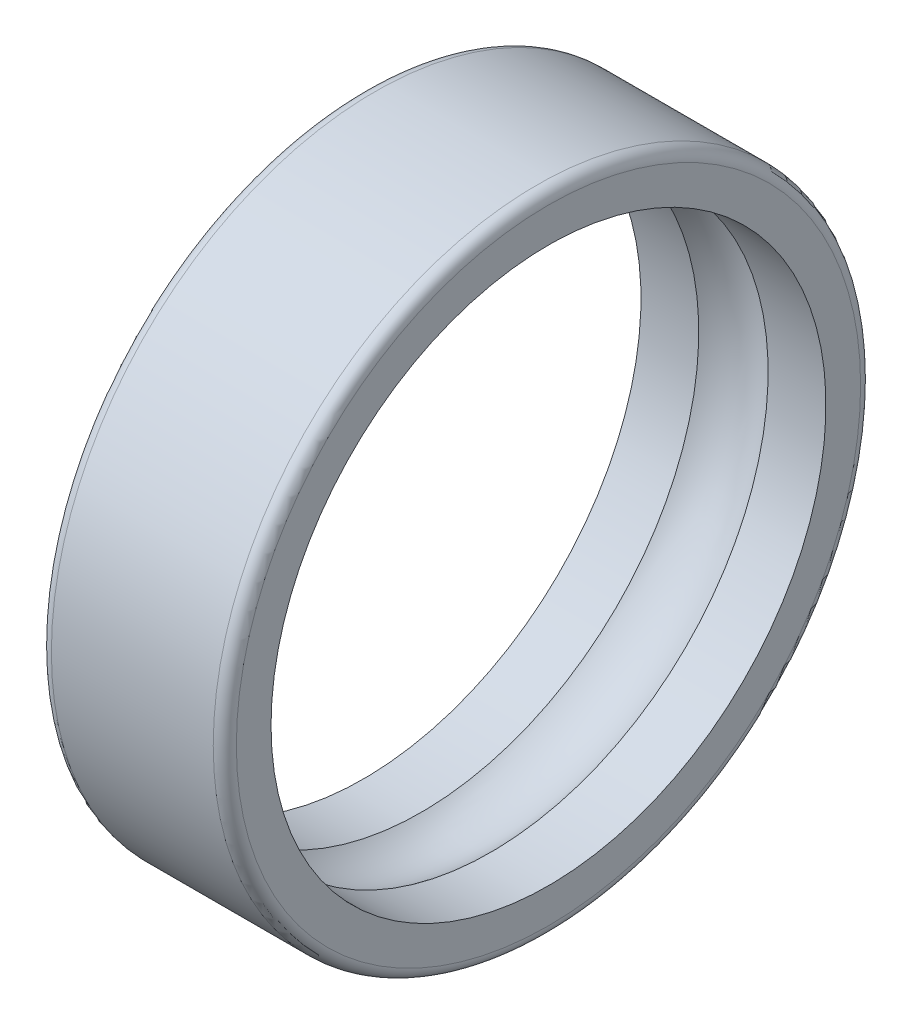
ISO-10303-21;
HEADER;
FILE_DESCRIPTION(('STEP AP214'),'2;1');
FILE_NAME('part.step','',(''),(''),'','','');
FILE_SCHEMA(('AUTOMOTIVE_DESIGN { 1 0 10303 214 1 1 1 1 }'));
ENDSEC;
DATA;
#1=APPLICATION_CONTEXT('core data for automotive mechanical design processes');
#2=APPLICATION_PROTOCOL_DEFINITION('international standard','automotive_design',2000,#1);
#3=PRODUCT_CONTEXT('',#1,'mechanical');
#4=PRODUCT('Part','Part','',(#3));
#5=PRODUCT_RELATED_PRODUCT_CATEGORY('part','',(#4));
#6=PRODUCT_DEFINITION_FORMATION('','',#4);
#7=PRODUCT_DEFINITION_CONTEXT('part definition',#1,'design');
#8=PRODUCT_DEFINITION('design','',#6,#7);
#9=PRODUCT_DEFINITION_SHAPE('','',#8);
#10=(LENGTH_UNIT() NAMED_UNIT(*) SI_UNIT(.MILLI.,.METRE.));
#11=(NAMED_UNIT(*) PLANE_ANGLE_UNIT() SI_UNIT($,.RADIAN.));
#12=(NAMED_UNIT(*) SI_UNIT($,.STERADIAN.) SOLID_ANGLE_UNIT());
#13=UNCERTAINTY_MEASURE_WITH_UNIT(LENGTH_MEASURE(1.E-05),#10,'distance_accuracy_value','');
#14=(GEOMETRIC_REPRESENTATION_CONTEXT(3) GLOBAL_UNCERTAINTY_ASSIGNED_CONTEXT((#13)) GLOBAL_UNIT_ASSIGNED_CONTEXT((#10,
#11,#12)) REPRESENTATION_CONTEXT('',''));
#15=CARTESIAN_POINT('',(0.,0.,0.));
#16=DIRECTION('',(0.,0.,1.));
#17=DIRECTION('',(1.,0.,0.));
#18=AXIS2_PLACEMENT_3D('',#15,#16,#17);
#19=CARTESIAN_POINT('',(0.5,0.,0.));
#20=DIRECTION('',(-1.,0.,0.));
#21=DIRECTION('',(0.,0.,1.));
#22=AXIS2_PLACEMENT_3D('',#19,#20,#21);
#23=TOROIDAL_SURFACE('',#22,13.5,0.5);
#24=CARTESIAN_POINT('',(0.,0.,0.));
#25=DIRECTION('',(-1.,0.,0.));
#26=DIRECTION('',(0.,0.,1.));
#27=AXIS2_PLACEMENT_3D('',#24,#25,#26);
#28=CIRCLE('',#27,13.5);
#29=CARTESIAN_POINT('',(0.,0.,13.5));
#30=VERTEX_POINT('',#29);
#31=EDGE_CURVE('E10',#30,#30,#28,.T.);
#32=ORIENTED_EDGE('',*,*,#31,.F.);
#33=EDGE_LOOP('',(#32));
#34=FACE_BOUND('',#33,.T.);
#35=CARTESIAN_POINT('',(0.500000000000003,0.,0.));
#36=DIRECTION('',(-1.,0.,0.));
#37=DIRECTION('',(0.,0.,1.));
#38=AXIS2_PLACEMENT_3D('',#35,#36,#37);
#39=CIRCLE('',#38,14.);
#40=CARTESIAN_POINT('',(0.500000000000003,0.,14.));
#41=VERTEX_POINT('',#40);
#42=EDGE_CURVE('E55',#41,#41,#39,.T.);
#43=ORIENTED_EDGE('',*,*,#42,.T.);
#44=EDGE_LOOP('',(#43));
#45=FACE_BOUND('',#44,.T.);
#46=ADVANCED_FACE('F27',(#34,#45),#23,.T.);
#47=CARTESIAN_POINT('',(0.,12.,0.));
#48=DIRECTION('',(-1.,0.,0.));
#49=DIRECTION('',(0.,0.,1.));
#50=AXIS2_PLACEMENT_3D('',#47,#48,#49);
#51=PLANE('',#50);
#52=ORIENTED_EDGE('',*,*,#31,.T.);
#53=EDGE_LOOP('',(#52));
#54=FACE_BOUND('',#53,.T.);
#55=CARTESIAN_POINT('',(0.,0.,0.));
#56=DIRECTION('',(-1.,0.,0.));
#57=DIRECTION('',(0.,0.,1.));
#58=AXIS2_PLACEMENT_3D('',#55,#56,#57);
#59=CIRCLE('',#58,12.);
#60=CARTESIAN_POINT('',(0.,0.,12.));
#61=VERTEX_POINT('',#60);
#62=EDGE_CURVE('E33',#61,#61,#59,.T.);
#63=ORIENTED_EDGE('',*,*,#62,.F.);
#64=EDGE_LOOP('',(#63));
#65=FACE_BOUND('',#64,.T.);
#66=ADVANCED_FACE('F84',(#54,#65),#51,.T.);
#67=CARTESIAN_POINT('',(0.,0.,0.));
#68=DIRECTION('',(-1.,0.,0.));
#69=DIRECTION('',(0.,0.,1.));
#70=AXIS2_PLACEMENT_3D('',#67,#68,#69);
#71=CYLINDRICAL_SURFACE('',#70,12.);
#72=CARTESIAN_POINT('',(2.5,0.,0.));
#73=DIRECTION('',(-1.,0.,0.));
#74=DIRECTION('',(0.,0.,1.));
#75=AXIS2_PLACEMENT_3D('',#72,#73,#74);
#76=CIRCLE('',#75,12.);
#77=CARTESIAN_POINT('',(2.5,0.,12.));
#78=VERTEX_POINT('',#77);
#79=EDGE_CURVE('E37',#78,#78,#76,.T.);
#80=ORIENTED_EDGE('',*,*,#79,.F.);
#81=EDGE_LOOP('',(#80));
#82=FACE_BOUND('',#81,.T.);
#83=ORIENTED_EDGE('',*,*,#62,.T.);
#84=EDGE_LOOP('',(#83));
#85=FACE_BOUND('',#84,.T.);
#86=ADVANCED_FACE('F89',(#82,#85),#71,.F.);
#87=CARTESIAN_POINT('',(4.,0.,0.));
#88=DIRECTION('',(-1.,0.,0.));
#89=DIRECTION('',(0.,0.,1.));
#90=AXIS2_PLACEMENT_3D('',#87,#88,#89);
#91=TOROIDAL_SURFACE('',#90,10.,2.5);
#92=ORIENTED_EDGE('',*,*,#79,.T.);
#93=EDGE_LOOP('',(#92));
#94=FACE_BOUND('',#93,.T.);
#95=CARTESIAN_POINT('',(5.5,0.,0.));
#96=DIRECTION('',(-1.,0.,0.));
#97=DIRECTION('',(0.,0.,1.));
#98=AXIS2_PLACEMENT_3D('',#95,#96,#97);
#99=CIRCLE('',#98,12.);
#100=CARTESIAN_POINT('',(5.5,0.,12.));
#101=VERTEX_POINT('',#100);
#102=EDGE_CURVE('E41',#101,#101,#99,.T.);
#103=ORIENTED_EDGE('',*,*,#102,.F.);
#104=EDGE_LOOP('',(#103));
#105=FACE_BOUND('',#104,.T.);
#106=ADVANCED_FACE('F80',(#94,#105),#91,.F.);
#107=CARTESIAN_POINT('',(0.,0.,0.));
#108=DIRECTION('',(-1.,0.,0.));
#109=DIRECTION('',(0.,0.,1.));
#110=AXIS2_PLACEMENT_3D('',#107,#108,#109);
#111=CYLINDRICAL_SURFACE('',#110,12.);
#112=CARTESIAN_POINT('',(7.99999999999995,0.,0.));
#113=DIRECTION('',(-1.,0.,0.));
#114=DIRECTION('',(0.,0.,1.));
#115=AXIS2_PLACEMENT_3D('',#112,#113,#114);
#116=CIRCLE('',#115,12.);
#117=CARTESIAN_POINT('',(7.99999999999995,0.,12.));
#118=VERTEX_POINT('',#117);
#119=EDGE_CURVE('E46',#118,#118,#116,.T.);
#120=ORIENTED_EDGE('',*,*,#119,.F.);
#121=EDGE_LOOP('',(#120));
#122=FACE_BOUND('',#121,.T.);
#123=ORIENTED_EDGE('',*,*,#102,.T.);
#124=EDGE_LOOP('',(#123));
#125=FACE_BOUND('',#124,.T.);
#126=ADVANCED_FACE('F74',(#122,#125),#111,.F.);
#127=CARTESIAN_POINT('',(7.99999999999999,13.5,0.));
#128=DIRECTION('',(1.,0.,0.));
#129=DIRECTION('',(0.,0.,-1.));
#130=AXIS2_PLACEMENT_3D('',#127,#128,#129);
#131=PLANE('',#130);
#132=ORIENTED_EDGE('',*,*,#119,.T.);
#133=EDGE_LOOP('',(#132));
#134=FACE_BOUND('',#133,.T.);
#135=CARTESIAN_POINT('',(7.99999999999999,0.,0.));
#136=DIRECTION('',(-1.,0.,0.));
#137=DIRECTION('',(0.,0.,1.));
#138=AXIS2_PLACEMENT_3D('',#135,#136,#137);
#139=CIRCLE('',#138,13.5);
#140=CARTESIAN_POINT('',(7.99999999999999,0.,13.5));
#141=VERTEX_POINT('',#140);
#142=EDGE_CURVE('E49',#141,#141,#139,.T.);
#143=ORIENTED_EDGE('',*,*,#142,.F.);
#144=EDGE_LOOP('',(#143));
#145=FACE_BOUND('',#144,.T.);
#146=ADVANCED_FACE('F69',(#134,#145),#131,.T.);
#147=CARTESIAN_POINT('',(7.49999999999999,0.,0.));
#148=DIRECTION('',(-1.,0.,0.));
#149=DIRECTION('',(0.,0.,1.));
#150=AXIS2_PLACEMENT_3D('',#147,#148,#149);
#151=TOROIDAL_SURFACE('',#150,13.5,0.5);
#152=CARTESIAN_POINT('',(7.49999999999998,0.,0.));
#153=DIRECTION('',(-1.,0.,0.));
#154=DIRECTION('',(0.,0.,1.));
#155=AXIS2_PLACEMENT_3D('',#152,#153,#154);
#156=CIRCLE('',#155,14.);
#157=CARTESIAN_POINT('',(7.49999999999998,0.,14.));
#158=VERTEX_POINT('',#157);
#159=EDGE_CURVE('E52',#158,#158,#156,.T.);
#160=ORIENTED_EDGE('',*,*,#159,.F.);
#161=EDGE_LOOP('',(#160));
#162=FACE_BOUND('',#161,.T.);
#163=ORIENTED_EDGE('',*,*,#142,.T.);
#164=EDGE_LOOP('',(#163));
#165=FACE_BOUND('',#164,.T.);
#166=ADVANCED_FACE('F63',(#162,#165),#151,.T.);
#167=CARTESIAN_POINT('',(0.,0.,0.));
#168=DIRECTION('',(-1.,0.,0.));
#169=DIRECTION('',(0.,0.,1.));
#170=AXIS2_PLACEMENT_3D('',#167,#168,#169);
#171=CYLINDRICAL_SURFACE('',#170,14.);
#172=ORIENTED_EDGE('',*,*,#42,.F.);
#173=EDGE_LOOP('',(#172));
#174=FACE_BOUND('',#173,.T.);
#175=ORIENTED_EDGE('',*,*,#159,.T.);
#176=EDGE_LOOP('',(#175));
#177=FACE_BOUND('',#176,.T.);
#178=ADVANCED_FACE('F60',(#174,#177),#171,.T.);
#179=CLOSED_SHELL('',(#46,#66,#86,#106,#126,#146,#166,#178));
#180=MANIFOLD_SOLID_BREP('B2',#179);
#181=ADVANCED_BREP_SHAPE_REPRESENTATION('',(#18,#180),#14);
#182=SHAPE_DEFINITION_REPRESENTATION(#9,#181);
ENDSEC;
END-ISO-10303-21;
